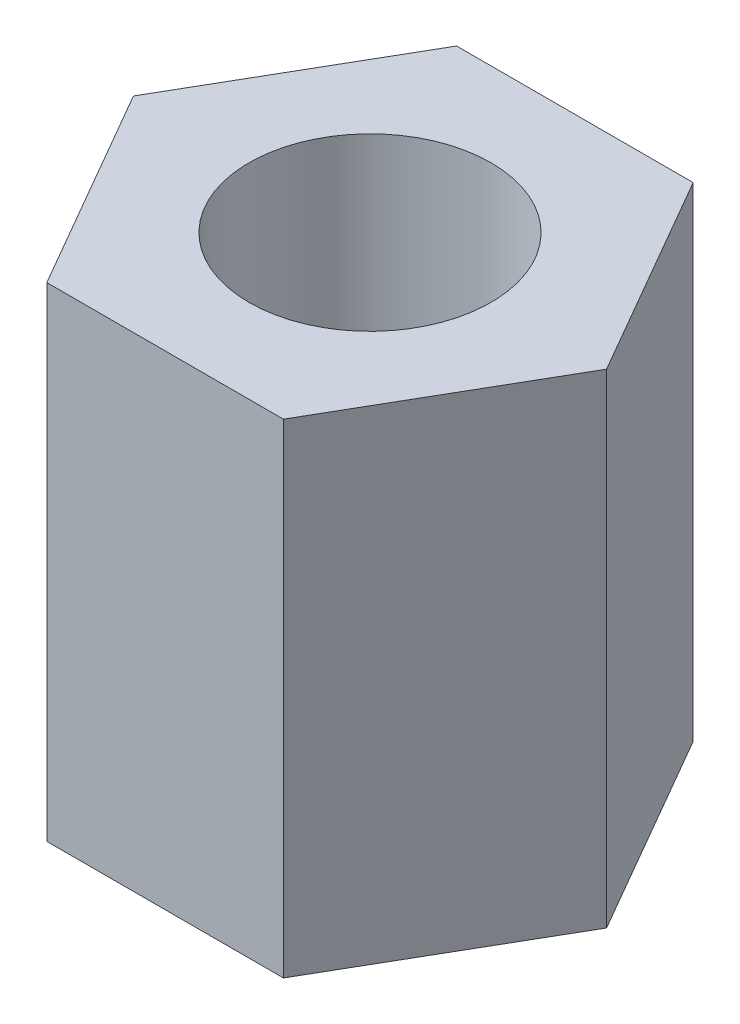
ISO-10303-21;
HEADER;
FILE_DESCRIPTION(('STEP AP214'),'2;1');
FILE_NAME('part.step','',(''),(''),'','','');
FILE_SCHEMA(('AUTOMOTIVE_DESIGN { 1 0 10303 214 1 1 1 1 }'));
ENDSEC;
DATA;
#1=APPLICATION_CONTEXT('core data for automotive mechanical design processes');
#2=APPLICATION_PROTOCOL_DEFINITION('international standard','automotive_design',2000,#1);
#3=PRODUCT_CONTEXT('',#1,'mechanical');
#4=PRODUCT('Part','Part','',(#3));
#5=PRODUCT_RELATED_PRODUCT_CATEGORY('part','',(#4));
#6=PRODUCT_DEFINITION_FORMATION('','',#4);
#7=PRODUCT_DEFINITION_CONTEXT('part definition',#1,'design');
#8=PRODUCT_DEFINITION('design','',#6,#7);
#9=PRODUCT_DEFINITION_SHAPE('','',#8);
#10=(LENGTH_UNIT() NAMED_UNIT(*) SI_UNIT(.MILLI.,.METRE.));
#11=(NAMED_UNIT(*) PLANE_ANGLE_UNIT() SI_UNIT($,.RADIAN.));
#12=(NAMED_UNIT(*) SI_UNIT($,.STERADIAN.) SOLID_ANGLE_UNIT());
#13=UNCERTAINTY_MEASURE_WITH_UNIT(LENGTH_MEASURE(1.E-05),#10,'distance_accuracy_value','');
#14=(GEOMETRIC_REPRESENTATION_CONTEXT(3) GLOBAL_UNCERTAINTY_ASSIGNED_CONTEXT((#13)) GLOBAL_UNIT_ASSIGNED_CONTEXT((#10,
#11,#12)) REPRESENTATION_CONTEXT('',''));
#15=CARTESIAN_POINT('',(0.,0.,0.));
#16=DIRECTION('',(0.,0.,1.));
#17=DIRECTION('',(1.,0.,0.));
#18=AXIS2_PLACEMENT_3D('',#15,#16,#17);
#19=CARTESIAN_POINT('',(0.,6.,0.));
#20=DIRECTION('',(0.,-1.,0.));
#21=DIRECTION('',(0.,0.,-1.));
#22=AXIS2_PLACEMENT_3D('',#19,#20,#21);
#23=PLANE('',#22);
#24=DIRECTION('',(0.5,0.,-0.866025403784439));
#25=VECTOR('',#24,1.);
#26=CARTESIAN_POINT('',(1.46646968374165,6.,2.54));
#27=LINE('',#26,#25);
#28=CARTESIAN_POINT('',(1.46646968374165,6.,2.54));
#29=VERTEX_POINT('',#28);
#30=CARTESIAN_POINT('',(2.9329393674833,6.,0.));
#31=VERTEX_POINT('',#30);
#32=EDGE_CURVE('E156',#29,#31,#27,.T.);
#33=ORIENTED_EDGE('',*,*,#32,.T.);
#34=DIRECTION('',(-0.5,0.,-0.866025403784439));
#35=VECTOR('',#34,1.);
#36=CARTESIAN_POINT('',(1.46646968374165,6.,-2.54));
#37=LINE('',#36,#35);
#38=CARTESIAN_POINT('',(1.46646968374165,6.,-2.54));
#39=VERTEX_POINT('',#38);
#40=EDGE_CURVE('E104',#31,#39,#37,.T.);
#41=ORIENTED_EDGE('',*,*,#40,.T.);
#42=DIRECTION('',(-1.,0.,0.));
#43=VECTOR('',#42,1.);
#44=CARTESIAN_POINT('',(1.46646968374165,6.,-2.54));
#45=LINE('',#44,#43);
#46=CARTESIAN_POINT('',(-1.46646968374165,6.,-2.54));
#47=VERTEX_POINT('',#46);
#48=EDGE_CURVE('E117',#39,#47,#45,.T.);
#49=ORIENTED_EDGE('',*,*,#48,.T.);
#50=DIRECTION('',(-0.5,0.,0.866025403784439));
#51=VECTOR('',#50,1.);
#52=CARTESIAN_POINT('',(-1.46646968374165,6.,-2.54));
#53=LINE('',#52,#51);
#54=CARTESIAN_POINT('',(-2.9329393674833,6.,0.));
#55=VERTEX_POINT('',#54);
#56=EDGE_CURVE('E111',#47,#55,#53,.T.);
#57=ORIENTED_EDGE('',*,*,#56,.T.);
#58=DIRECTION('',(0.5,0.,0.866025403784439));
#59=VECTOR('',#58,1.);
#60=CARTESIAN_POINT('',(-1.46646968374165,6.,2.54));
#61=LINE('',#60,#59);
#62=CARTESIAN_POINT('',(-1.46646968374165,6.,2.54));
#63=VERTEX_POINT('',#62);
#64=EDGE_CURVE('E115',#55,#63,#61,.T.);
#65=ORIENTED_EDGE('',*,*,#64,.T.);
#66=DIRECTION('',(1.,0.,0.));
#67=VECTOR('',#66,1.);
#68=CARTESIAN_POINT('',(1.46646968374165,6.,2.54));
#69=LINE('',#68,#67);
#70=EDGE_CURVE('E67',#63,#29,#69,.T.);
#71=ORIENTED_EDGE('',*,*,#70,.T.);
#72=EDGE_LOOP('',(#33,#41,#49,#57,#65,#71));
#73=FACE_BOUND('',#72,.T.);
#74=CARTESIAN_POINT('',(0.,6.,0.));
#75=DIRECTION('',(0.,1.,0.));
#76=DIRECTION('',(0.,0.,1.));
#77=AXIS2_PLACEMENT_3D('',#74,#75,#76);
#78=CIRCLE('',#77,1.5);
#79=CARTESIAN_POINT('',(0.,6.,1.5));
#80=VERTEX_POINT('',#79);
#81=EDGE_CURVE('E144',#80,#80,#78,.T.);
#82=ORIENTED_EDGE('',*,*,#81,.F.);
#83=EDGE_LOOP('',(#82));
#84=FACE_BOUND('',#83,.T.);
#85=ADVANCED_FACE('F49',(#73,#84),#23,.F.);
#86=CARTESIAN_POINT('',(0.,0.,0.));
#87=DIRECTION('',(0.,-1.,0.));
#88=DIRECTION('',(0.,0.,-1.));
#89=AXIS2_PLACEMENT_3D('',#86,#87,#88);
#90=PLANE('',#89);
#91=DIRECTION('',(0.5,0.,-0.866025403784439));
#92=VECTOR('',#91,1.);
#93=CARTESIAN_POINT('',(1.46646968374165,0.,2.54));
#94=LINE('',#93,#92);
#95=CARTESIAN_POINT('',(1.46646968374165,0.,2.54));
#96=VERTEX_POINT('',#95);
#97=CARTESIAN_POINT('',(2.9329393674833,0.,0.));
#98=VERTEX_POINT('',#97);
#99=EDGE_CURVE('E139',#96,#98,#94,.T.);
#100=ORIENTED_EDGE('',*,*,#99,.F.);
#101=DIRECTION('',(1.,0.,0.));
#102=VECTOR('',#101,1.);
#103=CARTESIAN_POINT('',(1.46646968374165,0.,2.54));
#104=LINE('',#103,#102);
#105=CARTESIAN_POINT('',(-1.46646968374165,0.,2.54));
#106=VERTEX_POINT('',#105);
#107=EDGE_CURVE('E96',#106,#96,#104,.T.);
#108=ORIENTED_EDGE('',*,*,#107,.F.);
#109=DIRECTION('',(0.5,0.,0.866025403784439));
#110=VECTOR('',#109,1.);
#111=CARTESIAN_POINT('',(-1.46646968374165,0.,2.54));
#112=LINE('',#111,#110);
#113=CARTESIAN_POINT('',(-2.9329393674833,0.,0.));
#114=VERTEX_POINT('',#113);
#115=EDGE_CURVE('E90',#114,#106,#112,.T.);
#116=ORIENTED_EDGE('',*,*,#115,.F.);
#117=DIRECTION('',(-0.5,0.,0.866025403784439));
#118=VECTOR('',#117,1.);
#119=CARTESIAN_POINT('',(-1.46646968374165,0.,-2.54));
#120=LINE('',#119,#118);
#121=CARTESIAN_POINT('',(-1.46646968374165,0.,-2.54));
#122=VERTEX_POINT('',#121);
#123=EDGE_CURVE('E126',#122,#114,#120,.T.);
#124=ORIENTED_EDGE('',*,*,#123,.F.);
#125=DIRECTION('',(-1.,0.,0.));
#126=VECTOR('',#125,1.);
#127=CARTESIAN_POINT('',(1.46646968374165,0.,-2.54));
#128=LINE('',#127,#126);
#129=CARTESIAN_POINT('',(1.46646968374165,0.,-2.54));
#130=VERTEX_POINT('',#129);
#131=EDGE_CURVE('E147',#130,#122,#128,.T.);
#132=ORIENTED_EDGE('',*,*,#131,.F.);
#133=DIRECTION('',(-0.5,0.,-0.866025403784439));
#134=VECTOR('',#133,1.);
#135=CARTESIAN_POINT('',(1.46646968374165,0.,-2.54));
#136=LINE('',#135,#134);
#137=EDGE_CURVE('E143',#98,#130,#136,.T.);
#138=ORIENTED_EDGE('',*,*,#137,.F.);
#139=EDGE_LOOP('',(#100,#108,#116,#124,#132,#138));
#140=FACE_BOUND('',#139,.T.);
#141=CARTESIAN_POINT('',(0.,0.,0.));
#142=DIRECTION('',(0.,1.,0.));
#143=DIRECTION('',(0.,0.,1.));
#144=AXIS2_PLACEMENT_3D('',#141,#142,#143);
#145=CIRCLE('',#144,1.5);
#146=CARTESIAN_POINT('',(0.,0.,1.5));
#147=VERTEX_POINT('',#146);
#148=EDGE_CURVE('E289',#147,#147,#145,.T.);
#149=ORIENTED_EDGE('',*,*,#148,.T.);
#150=EDGE_LOOP('',(#149));
#151=FACE_BOUND('',#150,.T.);
#152=ADVANCED_FACE('F169',(#140,#151),#90,.T.);
#153=CARTESIAN_POINT('',(1.46646968374165,6.,2.54));
#154=DIRECTION('',(-0.866025403784439,0.,-0.5));
#155=DIRECTION('',(-0.5,0.,0.866025403784439));
#156=AXIS2_PLACEMENT_3D('',#153,#154,#155);
#157=PLANE('',#156);
#158=ORIENTED_EDGE('',*,*,#99,.T.);
#159=DIRECTION('',(0.,-1.,0.));
#160=VECTOR('',#159,1.);
#161=CARTESIAN_POINT('',(2.9329393674833,6.,0.));
#162=LINE('',#161,#160);
#163=EDGE_CURVE('E11',#31,#98,#162,.T.);
#164=ORIENTED_EDGE('',*,*,#163,.F.);
#165=ORIENTED_EDGE('',*,*,#32,.F.);
#166=DIRECTION('',(0.,-1.,0.));
#167=VECTOR('',#166,1.);
#168=CARTESIAN_POINT('',(1.46646968374165,6.,2.54));
#169=LINE('',#168,#167);
#170=EDGE_CURVE('E135',#29,#96,#169,.T.);
#171=ORIENTED_EDGE('',*,*,#170,.T.);
#172=EDGE_LOOP('',(#158,#164,#165,#171));
#173=FACE_BOUND('',#172,.T.);
#174=ADVANCED_FACE('F51',(#173),#157,.F.);
#175=CARTESIAN_POINT('',(1.46646968374165,6.,-2.54));
#176=DIRECTION('',(-0.866025403784439,0.,0.5));
#177=DIRECTION('',(0.5,0.,0.866025403784439));
#178=AXIS2_PLACEMENT_3D('',#175,#176,#177);
#179=PLANE('',#178);
#180=ORIENTED_EDGE('',*,*,#137,.T.);
#181=DIRECTION('',(0.,-1.,0.));
#182=VECTOR('',#181,1.);
#183=CARTESIAN_POINT('',(1.46646968374165,6.,-2.54));
#184=LINE('',#183,#182);
#185=EDGE_CURVE('E59',#39,#130,#184,.T.);
#186=ORIENTED_EDGE('',*,*,#185,.F.);
#187=ORIENTED_EDGE('',*,*,#40,.F.);
#188=ORIENTED_EDGE('',*,*,#163,.T.);
#189=EDGE_LOOP('',(#180,#186,#187,#188));
#190=FACE_BOUND('',#189,.T.);
#191=ADVANCED_FACE('F194',(#190),#179,.F.);
#192=CARTESIAN_POINT('',(1.46646968374165,6.,-2.54));
#193=DIRECTION('',(0.,0.,1.));
#194=DIRECTION('',(1.,0.,0.));
#195=AXIS2_PLACEMENT_3D('',#192,#193,#194);
#196=PLANE('',#195);
#197=ORIENTED_EDGE('',*,*,#131,.T.);
#198=DIRECTION('',(0.,-1.,0.));
#199=VECTOR('',#198,1.);
#200=CARTESIAN_POINT('',(-1.46646968374165,6.,-2.54));
#201=LINE('',#200,#199);
#202=EDGE_CURVE('E128',#47,#122,#201,.T.);
#203=ORIENTED_EDGE('',*,*,#202,.F.);
#204=ORIENTED_EDGE('',*,*,#48,.F.);
#205=ORIENTED_EDGE('',*,*,#185,.T.);
#206=EDGE_LOOP('',(#197,#203,#204,#205));
#207=FACE_BOUND('',#206,.T.);
#208=ADVANCED_FACE('F166',(#207),#196,.F.);
#209=CARTESIAN_POINT('',(-1.46646968374165,6.,-2.54));
#210=DIRECTION('',(0.866025403784439,0.,0.5));
#211=DIRECTION('',(0.5,0.,-0.866025403784439));
#212=AXIS2_PLACEMENT_3D('',#209,#210,#211);
#213=PLANE('',#212);
#214=ORIENTED_EDGE('',*,*,#123,.T.);
#215=DIRECTION('',(0.,-1.,0.));
#216=VECTOR('',#215,1.);
#217=CARTESIAN_POINT('',(-2.9329393674833,6.,0.));
#218=LINE('',#217,#216);
#219=EDGE_CURVE('E123',#55,#114,#218,.T.);
#220=ORIENTED_EDGE('',*,*,#219,.F.);
#221=ORIENTED_EDGE('',*,*,#56,.F.);
#222=ORIENTED_EDGE('',*,*,#202,.T.);
#223=EDGE_LOOP('',(#214,#220,#221,#222));
#224=FACE_BOUND('',#223,.T.);
#225=ADVANCED_FACE('F124',(#224),#213,.F.);
#226=CARTESIAN_POINT('',(-1.46646968374165,6.,2.54));
#227=DIRECTION('',(0.866025403784439,0.,-0.5));
#228=DIRECTION('',(-0.5,0.,-0.866025403784439));
#229=AXIS2_PLACEMENT_3D('',#226,#227,#228);
#230=PLANE('',#229);
#231=ORIENTED_EDGE('',*,*,#115,.T.);
#232=DIRECTION('',(0.,-1.,0.));
#233=VECTOR('',#232,1.);
#234=CARTESIAN_POINT('',(-1.46646968374165,6.,2.54));
#235=LINE('',#234,#233);
#236=EDGE_CURVE('E129',#63,#106,#235,.T.);
#237=ORIENTED_EDGE('',*,*,#236,.F.);
#238=ORIENTED_EDGE('',*,*,#64,.F.);
#239=ORIENTED_EDGE('',*,*,#219,.T.);
#240=EDGE_LOOP('',(#231,#237,#238,#239));
#241=FACE_BOUND('',#240,.T.);
#242=ADVANCED_FACE('F131',(#241),#230,.F.);
#243=CARTESIAN_POINT('',(1.46646968374165,6.,2.54));
#244=DIRECTION('',(0.,0.,-1.));
#245=DIRECTION('',(-1.,0.,0.));
#246=AXIS2_PLACEMENT_3D('',#243,#244,#245);
#247=PLANE('',#246);
#248=ORIENTED_EDGE('',*,*,#107,.T.);
#249=ORIENTED_EDGE('',*,*,#170,.F.);
#250=ORIENTED_EDGE('',*,*,#70,.F.);
#251=ORIENTED_EDGE('',*,*,#236,.T.);
#252=EDGE_LOOP('',(#248,#249,#250,#251));
#253=FACE_BOUND('',#252,.T.);
#254=ADVANCED_FACE('F174',(#253),#247,.F.);
#255=CARTESIAN_POINT('',(0.,6.,0.));
#256=DIRECTION('',(0.,-1.,0.));
#257=DIRECTION('',(0.,0.,-1.));
#258=AXIS2_PLACEMENT_3D('',#255,#256,#257);
#259=CYLINDRICAL_SURFACE('',#258,1.5);
#260=ORIENTED_EDGE('',*,*,#81,.T.);
#261=EDGE_LOOP('',(#260));
#262=FACE_BOUND('',#261,.T.);
#263=ORIENTED_EDGE('',*,*,#148,.F.);
#264=EDGE_LOOP('',(#263));
#265=FACE_BOUND('',#264,.T.);
#266=ADVANCED_FACE('F176',(#262,#265),#259,.F.);
#267=CLOSED_SHELL('',(#85,#152,#174,#191,#208,#225,#242,#254,#266));
#268=MANIFOLD_SOLID_BREP('B2',#267);
#269=ADVANCED_BREP_SHAPE_REPRESENTATION('',(#18,#268),#14);
#270=SHAPE_DEFINITION_REPRESENTATION(#9,#269);
ENDSEC;
END-ISO-10303-21;
